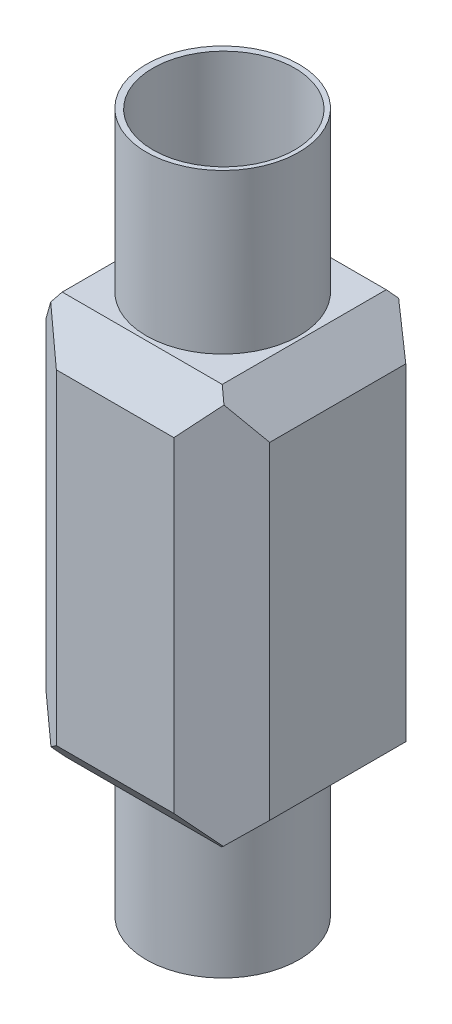
ISO-10303-21;
HEADER;
FILE_DESCRIPTION(('STEP AP214'),'2;1');
FILE_NAME('part.step','',(''),(''),'','','');
FILE_SCHEMA(('AUTOMOTIVE_DESIGN { 1 0 10303 214 1 1 1 1 }'));
ENDSEC;
DATA;
#1=APPLICATION_CONTEXT('core data for automotive mechanical design processes');
#2=APPLICATION_PROTOCOL_DEFINITION('international standard','automotive_design',2000,#1);
#3=PRODUCT_CONTEXT('',#1,'mechanical');
#4=PRODUCT('Part','Part','',(#3));
#5=PRODUCT_RELATED_PRODUCT_CATEGORY('part','',(#4));
#6=PRODUCT_DEFINITION_FORMATION('','',#4);
#7=PRODUCT_DEFINITION_CONTEXT('part definition',#1,'design');
#8=PRODUCT_DEFINITION('design','',#6,#7);
#9=PRODUCT_DEFINITION_SHAPE('','',#8);
#10=(LENGTH_UNIT() NAMED_UNIT(*) SI_UNIT(.MILLI.,.METRE.));
#11=(NAMED_UNIT(*) PLANE_ANGLE_UNIT() SI_UNIT($,.RADIAN.));
#12=(NAMED_UNIT(*) SI_UNIT($,.STERADIAN.) SOLID_ANGLE_UNIT());
#13=UNCERTAINTY_MEASURE_WITH_UNIT(LENGTH_MEASURE(1.E-05),#10,'distance_accuracy_value','');
#14=(GEOMETRIC_REPRESENTATION_CONTEXT(3) GLOBAL_UNCERTAINTY_ASSIGNED_CONTEXT((#13)) GLOBAL_UNIT_ASSIGNED_CONTEXT((#10,
#11,#12)) REPRESENTATION_CONTEXT('',''));
#15=CARTESIAN_POINT('',(0.,0.,0.));
#16=DIRECTION('',(0.,0.,1.));
#17=DIRECTION('',(1.,0.,0.));
#18=AXIS2_PLACEMENT_3D('',#15,#16,#17);
#19=CARTESIAN_POINT('',(0.,180.,0.));
#20=DIRECTION('',(-1.,0.,0.));
#21=DIRECTION('',(0.,0.,1.));
#22=AXIS2_PLACEMENT_3D('',#19,#20,#21);
#23=PLANE('',#22);
#24=DIRECTION('',(0.,0.,1.));
#25=VECTOR('',#24,1.);
#26=CARTESIAN_POINT('',(0.,162.25857257587,0.));
#27=LINE('',#26,#25);
#28=CARTESIAN_POINT('',(0.,162.25857257587,-79.942972796148));
#29=VERTEX_POINT('',#28);
#30=CARTESIAN_POINT('',(0.,162.25857257587,-18.835743686039));
#31=VERTEX_POINT('',#30);
#32=EDGE_CURVE('E266',#29,#31,#27,.T.);
#33=ORIENTED_EDGE('',*,*,#32,.T.);
#34=DIRECTION('',(0.,-1.,0.));
#35=VECTOR('',#34,1.);
#36=CARTESIAN_POINT('',(0.,180.,-18.835743686039));
#37=LINE('',#36,#35);
#38=CARTESIAN_POINT('',(0.,15.2573853040028,-18.835743686039));
#39=VERTEX_POINT('',#38);
#40=EDGE_CURVE('E220',#31,#39,#37,.T.);
#41=ORIENTED_EDGE('',*,*,#40,.T.);
#42=DIRECTION('',(0.,0.,1.));
#43=VECTOR('',#42,1.);
#44=CARTESIAN_POINT('',(0.,15.2573853040028,-400.));
#45=LINE('',#44,#43);
#46=CARTESIAN_POINT('',(0.,15.2573853040028,-79.942972796148));
#47=VERTEX_POINT('',#46);
#48=EDGE_CURVE('E255',#47,#39,#45,.T.);
#49=ORIENTED_EDGE('',*,*,#48,.F.);
#50=DIRECTION('',(0.,1.,0.));
#51=VECTOR('',#50,1.);
#52=CARTESIAN_POINT('',(0.,180.,-79.942972796148));
#53=LINE('',#52,#51);
#54=EDGE_CURVE('E157',#47,#29,#53,.T.);
#55=ORIENTED_EDGE('',*,*,#54,.T.);
#56=EDGE_LOOP('',(#33,#41,#49,#55));
#57=FACE_BOUND('',#56,.T.);
#58=ADVANCED_FACE('F33',(#57),#23,.F.);
#59=CARTESIAN_POINT('',(0.,180.,-100.));
#60=DIRECTION('',(0.,0.,1.));
#61=DIRECTION('',(1.,0.,0.));
#62=AXIS2_PLACEMENT_3D('',#59,#60,#61);
#63=PLANE('',#62);
#64=DIRECTION('',(-1.,0.,0.));
#65=VECTOR('',#64,1.);
#66=CARTESIAN_POINT('',(0.,11.2531638573118,-100.));
#67=LINE('',#66,#65);
#68=CARTESIAN_POINT('',(-26.8680350721203,11.2531638573118,-100.));
#69=VERTEX_POINT('',#68);
#70=CARTESIAN_POINT('',(-78.23623075056,11.2531638573118,-100.));
#71=VERTEX_POINT('',#70);
#72=EDGE_CURVE('E173',#69,#71,#67,.T.);
#73=ORIENTED_EDGE('',*,*,#72,.T.);
#74=DIRECTION('',(0.,1.,0.));
#75=VECTOR('',#74,1.);
#76=CARTESIAN_POINT('',(-78.23623075056,180.,-100.));
#77=LINE('',#76,#75);
#78=CARTESIAN_POINT('',(-78.23623075056,164.310416887307,-100.));
#79=VERTEX_POINT('',#78);
#80=EDGE_CURVE('E246',#71,#79,#77,.T.);
#81=ORIENTED_EDGE('',*,*,#80,.T.);
#82=DIRECTION('',(1.,0.,0.));
#83=VECTOR('',#82,1.);
#84=CARTESIAN_POINT('',(0.,164.310416887307,-100.));
#85=LINE('',#84,#83);
#86=CARTESIAN_POINT('',(-26.8680350721203,164.310416887307,-100.));
#87=VERTEX_POINT('',#86);
#88=EDGE_CURVE('E292',#79,#87,#85,.T.);
#89=ORIENTED_EDGE('',*,*,#88,.T.);
#90=DIRECTION('',(0.,-1.,0.));
#91=VECTOR('',#90,1.);
#92=CARTESIAN_POINT('',(-26.8680350721203,180.,-100.));
#93=LINE('',#92,#91);
#94=EDGE_CURVE('E174',#87,#69,#93,.T.);
#95=ORIENTED_EDGE('',*,*,#94,.T.);
#96=EDGE_LOOP('',(#73,#81,#89,#95));
#97=FACE_BOUND('',#96,.T.);
#98=ADVANCED_FACE('F374',(#97),#63,.F.);
#99=CARTESIAN_POINT('',(-100.,180.,0.));
#100=DIRECTION('',(1.,0.,0.));
#101=DIRECTION('',(0.,0.,-1.));
#102=AXIS2_PLACEMENT_3D('',#99,#100,#101);
#103=PLANE('',#102);
#104=DIRECTION('',(0.,0.,-1.));
#105=VECTOR('',#104,1.);
#106=CARTESIAN_POINT('',(-100.,160.896793159201,0.));
#107=LINE('',#106,#105);
#108=CARTESIAN_POINT('',(-100.,160.896793159201,-18.4618277268646));
#109=VERTEX_POINT('',#108);
#110=CARTESIAN_POINT('',(-100.,160.896793159201,-80.507743362499));
#111=VERTEX_POINT('',#110);
#112=EDGE_CURVE('E277',#109,#111,#107,.T.);
#113=ORIENTED_EDGE('',*,*,#112,.T.);
#114=DIRECTION('',(0.,-1.,0.));
#115=VECTOR('',#114,1.);
#116=CARTESIAN_POINT('',(-100.,180.,-80.507743362499));
#117=LINE('',#116,#115);
#118=CARTESIAN_POINT('',(-100.,14.8474354345408,-80.507743362499));
#119=VERTEX_POINT('',#118);
#120=EDGE_CURVE('E243',#111,#119,#117,.T.);
#121=ORIENTED_EDGE('',*,*,#120,.T.);
#122=DIRECTION('',(0.,0.,1.));
#123=VECTOR('',#122,1.);
#124=CARTESIAN_POINT('',(-100.,14.8474354345408,0.));
#125=LINE('',#124,#123);
#126=CARTESIAN_POINT('',(-100.,14.8474354345408,-18.4618277268646));
#127=VERTEX_POINT('',#126);
#128=EDGE_CURVE('E280',#119,#127,#125,.T.);
#129=ORIENTED_EDGE('',*,*,#128,.T.);
#130=DIRECTION('',(0.,1.,0.));
#131=VECTOR('',#130,1.);
#132=CARTESIAN_POINT('',(-100.,180.,-18.4618277268646));
#133=LINE('',#132,#131);
#134=EDGE_CURVE('E56',#127,#109,#133,.T.);
#135=ORIENTED_EDGE('',*,*,#134,.T.);
#136=EDGE_LOOP('',(#113,#121,#129,#135));
#137=FACE_BOUND('',#136,.T.);
#138=ADVANCED_FACE('F335',(#137),#103,.F.);
#139=CARTESIAN_POINT('',(0.,180.,0.));
#140=DIRECTION('',(0.,0.,-1.));
#141=DIRECTION('',(-1.,0.,0.));
#142=AXIS2_PLACEMENT_3D('',#139,#140,#141);
#143=PLANE('',#142);
#144=DIRECTION('',(1.,0.,0.));
#145=VECTOR('',#144,1.);
#146=CARTESIAN_POINT('',(0.,15.2573853040028,0.));
#147=LINE('',#146,#145);
#148=CARTESIAN_POINT('',(-76.9899954986816,15.2573853040028,0.));
#149=VERTEX_POINT('',#148);
#150=CARTESIAN_POINT('',(-24.2126205432622,15.2573853040028,0.));
#151=VERTEX_POINT('',#150);
#152=EDGE_CURVE('E288',#149,#151,#147,.T.);
#153=ORIENTED_EDGE('',*,*,#152,.T.);
#154=DIRECTION('',(0.,1.,0.));
#155=VECTOR('',#154,1.);
#156=CARTESIAN_POINT('',(-24.2126205432622,180.,0.));
#157=LINE('',#156,#155);
#158=CARTESIAN_POINT('',(-24.2126205432622,161.414269941332,0.));
#159=VERTEX_POINT('',#158);
#160=EDGE_CURVE('E217',#151,#159,#157,.T.);
#161=ORIENTED_EDGE('',*,*,#160,.T.);
#162=DIRECTION('',(-1.,0.,0.));
#163=VECTOR('',#162,1.);
#164=CARTESIAN_POINT('',(0.,161.414269941332,0.));
#165=LINE('',#164,#163);
#166=CARTESIAN_POINT('',(-76.9899954986816,161.414269941332,0.));
#167=VERTEX_POINT('',#166);
#168=EDGE_CURVE('E295',#159,#167,#165,.T.);
#169=ORIENTED_EDGE('',*,*,#168,.T.);
#170=DIRECTION('',(0.,-1.,0.));
#171=VECTOR('',#170,1.);
#172=CARTESIAN_POINT('',(-76.9899954986816,180.,0.));
#173=LINE('',#172,#171);
#174=EDGE_CURVE('E232',#167,#149,#173,.T.);
#175=ORIENTED_EDGE('',*,*,#174,.T.);
#176=EDGE_LOOP('',(#153,#161,#169,#175));
#177=FACE_BOUND('',#176,.T.);
#178=ADVANCED_FACE('F346',(#177),#143,.F.);
#179=CARTESIAN_POINT('',(0.,180.,0.));
#180=DIRECTION('',(0.,1.,0.));
#181=DIRECTION('',(0.,0.,1.));
#182=AXIS2_PLACEMENT_3D('',#179,#180,#181);
#183=PLANE('',#182);
#184=DIRECTION('',(0.,0.,-1.));
#185=VECTOR('',#184,1.);
#186=CARTESIAN_POINT('',(-87.3310077399419,180.,0.));
#187=LINE('',#186,#185);
#188=CARTESIAN_POINT('',(-87.3310077399419,180.,-12.9819708694114));
#189=VERTEX_POINT('',#188);
#190=CARTESIAN_POINT('',(-87.3310077399419,180.,-86.6502872632608));
#191=VERTEX_POINT('',#190);
#192=EDGE_CURVE('E272',#189,#191,#187,.T.);
#193=ORIENTED_EDGE('',*,*,#192,.F.);
#194=DIRECTION('',(-1.,0.,0.));
#195=VECTOR('',#194,1.);
#196=CARTESIAN_POINT('',(0.,180.,-12.9819708694114));
#197=LINE('',#196,#195);
#198=CARTESIAN_POINT('',(-15.4785584814982,180.,-12.9819708694114));
#199=VERTEX_POINT('',#198);
#200=EDGE_CURVE('E312',#199,#189,#197,.T.);
#201=ORIENTED_EDGE('',*,*,#200,.F.);
#202=DIRECTION('',(0.,0.,1.));
#203=VECTOR('',#202,1.);
#204=CARTESIAN_POINT('',(-15.4785584814982,180.,0.));
#205=LINE('',#204,#203);
#206=CARTESIAN_POINT('',(-15.4785584814982,180.,-86.6502872632608));
#207=VERTEX_POINT('',#206);
#208=EDGE_CURVE('E263',#207,#199,#205,.T.);
#209=ORIENTED_EDGE('',*,*,#208,.F.);
#210=DIRECTION('',(1.,0.,0.));
#211=VECTOR('',#210,1.);
#212=CARTESIAN_POINT('',(0.,180.,-86.6502872632607));
#213=LINE('',#212,#211);
#214=EDGE_CURVE('E309',#191,#207,#213,.T.);
#215=ORIENTED_EDGE('',*,*,#214,.F.);
#216=EDGE_LOOP('',(#193,#201,#209,#215));
#217=FACE_BOUND('',#216,.T.);
#218=CARTESIAN_POINT('',(-51.3772918332052,180.,-49.0765363844359));
#219=DIRECTION('',(0.,1.,0.));
#220=DIRECTION('',(0.,0.,1.));
#221=AXIS2_PLACEMENT_3D('',#218,#219,#220);
#222=CIRCLE('',#221,34.2577901971357);
#223=CARTESIAN_POINT('',(-51.3772918332052,180.,-14.8187461873002));
#224=VERTEX_POINT('',#223);
#225=EDGE_CURVE('E298',#224,#224,#222,.F.);
#226=ORIENTED_EDGE('',*,*,#225,.T.);
#227=EDGE_LOOP('',(#226));
#228=FACE_BOUND('',#227,.T.);
#229=ADVANCED_FACE('F328',(#217,#228),#183,.T.);
#230=CARTESIAN_POINT('',(0.,0.,0.));
#231=DIRECTION('',(0.,1.,0.));
#232=DIRECTION('',(0.,0.,1.));
#233=AXIS2_PLACEMENT_3D('',#230,#231,#232);
#234=PLANE('',#233);
#235=DIRECTION('',(1.,0.,0.));
#236=VECTOR('',#235,1.);
#237=CARTESIAN_POINT('',(0.,0.,-86.7744382892866));
#238=LINE('',#237,#236);
#239=CARTESIAN_POINT('',(-85.6232873351068,0.,-86.7744382892867));
#240=VERTEX_POINT('',#239);
#241=CARTESIAN_POINT('',(-15.6949887514202,0.,-86.7744382892866));
#242=VERTEX_POINT('',#241);
#243=EDGE_CURVE('E307',#240,#242,#238,.T.);
#244=ORIENTED_EDGE('',*,*,#243,.T.);
#245=DIRECTION('',(0.,0.,1.));
#246=VECTOR('',#245,1.);
#247=CARTESIAN_POINT('',(-15.6949887514202,0.,-400.));
#248=LINE('',#247,#246);
#249=CARTESIAN_POINT('',(-15.6949887514202,0.,-12.9819708694115));
#250=VERTEX_POINT('',#249);
#251=EDGE_CURVE('E179',#242,#250,#248,.T.);
#252=ORIENTED_EDGE('',*,*,#251,.T.);
#253=DIRECTION('',(-1.,0.,0.));
#254=VECTOR('',#253,1.);
#255=CARTESIAN_POINT('',(0.,0.,-12.9819708694114));
#256=LINE('',#255,#254);
#257=CARTESIAN_POINT('',(-85.6232873351069,0.,-12.9819708694114));
#258=VERTEX_POINT('',#257);
#259=EDGE_CURVE('E304',#250,#258,#256,.T.);
#260=ORIENTED_EDGE('',*,*,#259,.T.);
#261=DIRECTION('',(0.,0.,1.));
#262=VECTOR('',#261,1.);
#263=CARTESIAN_POINT('',(-85.6232873351068,0.,-400.));
#264=LINE('',#263,#262);
#265=CARTESIAN_POINT('',(-85.6232873351068,0.,-48.1776585981388));
#266=VERTEX_POINT('',#265);
#267=EDGE_CURVE('E257',#266,#258,#264,.T.);
#268=ORIENTED_EDGE('',*,*,#267,.F.);
#269=CARTESIAN_POINT('',(-51.3772918332052,0.,-49.0765363844359));
#270=DIRECTION('',(0.,1.,0.));
#271=DIRECTION('',(0.,0.,1.));
#272=AXIS2_PLACEMENT_3D('',#269,#270,#271);
#273=CIRCLE('',#272,34.2577901971357);
#274=CARTESIAN_POINT('',(-85.6232873351068,0.,-49.9754141707329));
#275=VERTEX_POINT('',#274);
#276=EDGE_CURVE('E301',#275,#266,#273,.F.);
#277=ORIENTED_EDGE('',*,*,#276,.F.);
#278=EDGE_CURVE('E262',#240,#275,#264,.T.);
#279=ORIENTED_EDGE('',*,*,#278,.F.);
#280=EDGE_LOOP('',(#244,#252,#260,#268,#277,#279));
#281=FACE_BOUND('',#280,.T.);
#282=ADVANCED_FACE('F355',(#281),#234,.F.);
#283=CARTESIAN_POINT('',(-51.3772918332052,530.,-49.0765363844359));
#284=DIRECTION('',(0.,-1.,0.));
#285=DIRECTION('',(0.,0.,-1.));
#286=AXIS2_PLACEMENT_3D('',#283,#284,#285);
#287=CYLINDRICAL_SURFACE('',#286,34.2577901971357);
#288=CARTESIAN_POINT('',(-51.3772918332052,-62.6813888831705,-49.0765363844359));
#289=DIRECTION('',(0.,1.,0.));
#290=DIRECTION('',(0.,0.,1.));
#291=AXIS2_PLACEMENT_3D('',#288,#289,#290);
#292=CIRCLE('',#291,34.2577901971357);
#293=CARTESIAN_POINT('',(-51.3772918332052,-62.6813888831705,-14.8187461873002));
#294=VERTEX_POINT('',#293);
#295=EDGE_CURVE('E175',#294,#294,#292,.T.);
#296=ORIENTED_EDGE('',*,*,#295,.T.);
#297=EDGE_LOOP('',(#296));
#298=FACE_BOUND('',#297,.T.);
#299=ORIENTED_EDGE('',*,*,#276,.T.);
#300=CARTESIAN_POINT('',(-51.3772918332052,86.1655593743765,-49.0765363844359));
#301=DIRECTION('',(0.929293452580676,-0.369342224760028,0.));
#302=DIRECTION('',(-0.369342224760028,-0.929293452580676,0.));
#303=AXIS2_PLACEMENT_3D('',#300,#301,#302);
#304=ELLIPSE('',#303,92.7535166589576,34.2577901971357);
#305=EDGE_CURVE('E163',#266,#275,#304,.T.);
#306=ORIENTED_EDGE('',*,*,#305,.T.);
#307=EDGE_LOOP('',(#299,#306));
#308=FACE_BOUND('',#307,.T.);
#309=ADVANCED_FACE('F361',(#298,#308),#287,.T.);
#310=CARTESIAN_POINT('',(-51.3772918332052,251.428834106385,-49.0765363844359));
#311=DIRECTION('',(0.,-1.,0.));
#312=DIRECTION('',(0.,0.,-1.));
#313=AXIS2_PLACEMENT_3D('',#310,#311,#312);
#314=CIRCLE('',#313,34.2577901971357);
#315=CARTESIAN_POINT('',(-51.3772918332052,251.428834106385,-83.3343265815716));
#316=VERTEX_POINT('',#315);
#317=EDGE_CURVE('E36',#316,#316,#314,.T.);
#318=ORIENTED_EDGE('',*,*,#317,.T.);
#319=EDGE_LOOP('',(#318));
#320=FACE_BOUND('',#319,.T.);
#321=ORIENTED_EDGE('',*,*,#225,.F.);
#322=EDGE_LOOP('',(#321));
#323=FACE_BOUND('',#322,.T.);
#324=ADVANCED_FACE('F390',(#320,#323),#287,.T.);
#325=CARTESIAN_POINT('',(-400.,0.,-12.9819708694114));
#326=DIRECTION('',(0.,0.648030679802751,-0.761614231769854));
#327=DIRECTION('',(0.,0.761614231769854,0.648030679802751));
#328=AXIS2_PLACEMENT_3D('',#325,#326,#327);
#329=PLANE('',#328);
#330=DIRECTION('',(0.61672298954482,0.599527685323787,0.51011695590051));
#331=VECTOR('',#330,1.);
#332=CARTESIAN_POINT('',(-161.864341339676,-142.093898084117,-133.884655627931));
#333=LINE('',#332,#331);
#334=CARTESIAN_POINT('',(-11.7351397334046,3.84944157466014,-9.70661684314665));
#335=VERTEX_POINT('',#334);
#336=EDGE_CURVE('E285',#250,#335,#333,.T.);
#337=ORIENTED_EDGE('',*,*,#336,.T.);
#338=DIRECTION('',(-0.640041580283072,0.585178886954522,0.49790806959861));
#339=VECTOR('',#338,1.);
#340=CARTESIAN_POINT('',(-168.303530456469,146.997198592356,112.092759301453));
#341=LINE('',#340,#339);
#342=EDGE_CURVE('E214',#335,#151,#341,.T.);
#343=ORIENTED_EDGE('',*,*,#342,.T.);
#344=ORIENTED_EDGE('',*,*,#152,.F.);
#345=DIRECTION('',(-0.628329778342481,-0.592495582556801,-0.504133587751069));
#346=VECTOR('',#345,1.);
#347=CARTESIAN_POINT('',(-214.306055792962,-114.227420195886,-110.174052731693));
#348=LINE('',#347,#346);
#349=CARTESIAN_POINT('',(-89.2252600270588,3.71990859296577,-9.81683188730251));
#350=VERTEX_POINT('',#349);
#351=EDGE_CURVE('E229',#149,#350,#348,.T.);
#352=ORIENTED_EDGE('',*,*,#351,.T.);
#353=DIRECTION('',(0.593525479967305,-0.612958709544806,-0.521544940559053));
#354=VECTOR('',#353,1.);
#355=CARTESIAN_POINT('',(-196.369556391918,114.372326815193,84.3334069228837));
#356=LINE('',#355,#354);
#357=EDGE_CURVE('E283',#350,#258,#356,.T.);
#358=ORIENTED_EDGE('',*,*,#357,.T.);
#359=ORIENTED_EDGE('',*,*,#259,.F.);
#360=EDGE_LOOP('',(#337,#343,#344,#352,#358,#359));
#361=FACE_BOUND('',#360,.T.);
#362=ADVANCED_FACE('F343',(#361),#329,.F.);
#363=CARTESIAN_POINT('',(-400.,-1.44810398413053,-85.072517936176));
#364=DIRECTION('',(0.,0.761614231769854,0.648030679802751));
#365=DIRECTION('',(0.,-0.648030679802751,0.761614231769854));
#366=AXIS2_PLACEMENT_3D('',#363,#364,#365);
#367=PLANE('',#366);
#368=DIRECTION('',(-0.531512068777104,0.548914853332077,-0.645125882704847));
#369=VECTOR('',#368,1.);
#370=CARTESIAN_POINT('',(-173.430238872661,90.6819294539596,-193.350639369007));
#371=LINE('',#370,#369);
#372=CARTESIAN_POINT('',(-88.756666543567,3.23597240717974,-90.5775956331223));
#373=VERTEX_POINT('',#372);
#374=EDGE_CURVE('E181',#240,#373,#371,.T.);
#375=ORIENTED_EDGE('',*,*,#374,.T.);
#376=DIRECTION('',(0.647811274519912,0.49367033016184,-0.580198377904305));
#377=VECTOR('',#376,1.);
#378=CARTESIAN_POINT('',(-222.939997158503,-99.0196253762684,29.6008480382685));
#379=LINE('',#378,#377);
#380=EDGE_CURVE('E49',#373,#71,#379,.T.);
#381=ORIENTED_EDGE('',*,*,#380,.T.);
#382=ORIENTED_EDGE('',*,*,#72,.F.);
#383=DIRECTION('',(0.71415681894842,-0.453612235752694,0.533119102569883));
#384=VECTOR('',#383,1.);
#385=CARTESIAN_POINT('',(-207.374856665364,125.905997435364,-234.7486044833));
#386=LINE('',#385,#384);
#387=CARTESIAN_POINT('',(-13.109045681771,2.51384250175289,-89.7288944368655));
#388=VERTEX_POINT('',#387);
#389=EDGE_CURVE('E154',#69,#388,#386,.T.);
#390=ORIENTED_EDGE('',*,*,#389,.T.);
#391=DIRECTION('',(-0.554671653885714,-0.539206448286052,0.633715837345437));
#392=VECTOR('',#391,1.);
#393=CARTESIAN_POINT('',(-134.961850638957,-115.941495380351,49.48869814313));
#394=LINE('',#393,#392);
#395=EDGE_CURVE('E170',#388,#242,#394,.T.);
#396=ORIENTED_EDGE('',*,*,#395,.T.);
#397=ORIENTED_EDGE('',*,*,#243,.F.);
#398=EDGE_LOOP('',(#375,#381,#382,#390,#396,#397));
#399=FACE_BOUND('',#398,.T.);
#400=ADVANCED_FACE('F168',(#399),#367,.F.);
#401=CARTESIAN_POINT('',(-400.,181.854312783962,-85.072517936176));
#402=DIRECTION('',(0.,-0.648030679802751,0.761614231769854));
#403=DIRECTION('',(0.,-0.761614231769854,-0.648030679802751));
#404=AXIS2_PLACEMENT_3D('',#401,#402,#403);
#405=PLANE('',#404);
#406=ORIENTED_EDGE('',*,*,#88,.F.);
#407=DIRECTION('',(-0.586196421620691,0.617036215494435,0.52501434651579));
#408=VECTOR('',#407,1.);
#409=CARTESIAN_POINT('',(-199.742515919054,292.209147745934,8.82451777669856));
#410=LINE('',#409,#408);
#411=CARTESIAN_POINT('',(-89.7197502262504,176.398084325205,-89.7150302341283));
#412=VERTEX_POINT('',#411);
#413=EDGE_CURVE('E252',#79,#412,#410,.T.);
#414=ORIENTED_EDGE('',*,*,#413,.T.);
#415=DIRECTION('',(0.450846295048029,0.679818082679197,0.578433222337588));
#416=VECTOR('',#415,1.);
#417=CARTESIAN_POINT('',(-149.905059314496,85.6463982645104,-166.932438152694));
#418=LINE('',#417,#416);
#419=EDGE_CURVE('E275',#412,#191,#418,.T.);
#420=ORIENTED_EDGE('',*,*,#419,.T.);
#421=ORIENTED_EDGE('',*,*,#214,.T.);
#422=DIRECTION('',(0.553434352005852,-0.634343010808712,-0.539740088059059));
#423=VECTOR('',#422,1.);
#424=CARTESIAN_POINT('',(-134.375755077368,316.279226961578,29.3048989806743));
#425=LINE('',#424,#423);
#426=CARTESIAN_POINT('',(-12.6631489460901,176.772995107952,-89.3960318760697));
#427=VERTEX_POINT('',#426);
#428=EDGE_CURVE('E269',#207,#427,#425,.T.);
#429=ORIENTED_EDGE('',*,*,#428,.T.);
#430=DIRECTION('',(-0.655544261905661,-0.575138129838513,-0.489364743609938));
#431=VECTOR('',#430,1.);
#432=CARTESIAN_POINT('',(-175.813834897368,33.6336438044814,-211.188255894991));
#433=LINE('',#432,#431);
#434=EDGE_CURVE('E211',#427,#87,#433,.T.);
#435=ORIENTED_EDGE('',*,*,#434,.T.);
#436=EDGE_LOOP('',(#406,#414,#420,#421,#429,#435));
#437=FACE_BOUND('',#436,.T.);
#438=ADVANCED_FACE('F333',(#437),#405,.F.);
#439=CARTESIAN_POINT('',(-400.,180.,-12.9819708694114));
#440=DIRECTION('',(0.,-0.572631952015289,-0.819812568536955));
#441=DIRECTION('',(0.,0.819812568536955,-0.572631952015289));
#442=AXIS2_PLACEMENT_3D('',#439,#440,#441);
#443=PLANE('',#442);
#444=ORIENTED_EDGE('',*,*,#168,.F.);
#445=DIRECTION('',(0.592809662599005,0.660229985740458,-0.461164905276202));
#446=VECTOR('',#445,1.);
#447=CARTESIAN_POINT('',(-145.449727579038,26.3888503175813,94.314081752635));
#448=LINE('',#447,#446);
#449=CARTESIAN_POINT('',(-11.5588061904752,175.50720431267,-9.84379214029944));
#450=VERTEX_POINT('',#449);
#451=EDGE_CURVE('E226',#159,#450,#448,.T.);
#452=ORIENTED_EDGE('',*,*,#451,.T.);
#453=DIRECTION('',(-0.581756229910135,0.666805371044294,-0.465757754747281));
#454=VECTOR('',#453,1.);
#455=CARTESIAN_POINT('',(-145.616114750282,329.16285728132,-117.170929920885));
#456=LINE('',#455,#454);
#457=EDGE_CURVE('E315',#450,#199,#456,.T.);
#458=ORIENTED_EDGE('',*,*,#457,.T.);
#459=ORIENTED_EDGE('',*,*,#200,.T.);
#460=DIRECTION('',(-0.477656087901049,-0.720243793557945,0.503084028301759));
#461=VECTOR('',#460,1.);
#462=CARTESIAN_POINT('',(-158.668107447749,72.4328515506823,62.1527471786135));
#463=LINE('',#462,#461);
#464=CARTESIAN_POINT('',(-89.8558177428235,176.192912054195,-10.3227530364978));
#465=VERTEX_POINT('',#464);
#466=EDGE_CURVE('E185',#189,#465,#463,.T.);
#467=ORIENTED_EDGE('',*,*,#466,.T.);
#468=DIRECTION('',(0.58092414096382,-0.667292755263696,0.466098188387418));
#469=VECTOR('',#468,1.);
#470=CARTESIAN_POINT('',(-196.716895657626,298.941508788201,-96.0615807302122));
#471=LINE('',#470,#469);
#472=EDGE_CURVE('E239',#465,#167,#471,.T.);
#473=ORIENTED_EDGE('',*,*,#472,.T.);
#474=EDGE_LOOP('',(#444,#452,#458,#459,#467,#473));
#475=FACE_BOUND('',#474,.T.);
#476=ADVANCED_FACE('F319',(#475),#443,.F.);
#477=CARTESIAN_POINT('',(-15.6949887514202,180.248071028759,-400.));
#478=DIRECTION('',(-0.753527099389569,-0.657416846822123,0.));
#479=DIRECTION('',(0.657416846822123,-0.753527099389569,0.));
#480=AXIS2_PLACEMENT_3D('',#477,#478,#479);
#481=PLANE('',#480);
#482=ORIENTED_EDGE('',*,*,#457,.F.);
#483=DIRECTION('',(0.585312331350639,-0.670881352389389,-0.45533250025126));
#484=VECTOR('',#483,1.);
#485=CARTESIAN_POINT('',(89.1437612655201,60.0825480645017,-88.1834227365845));
#486=LINE('',#485,#484);
#487=EDGE_CURVE('E223',#450,#31,#486,.T.);
#488=ORIENTED_EDGE('',*,*,#487,.T.);
#489=ORIENTED_EDGE('',*,*,#32,.F.);
#490=DIRECTION('',(-0.590175998555204,0.676456057477596,-0.440567240079464));
#491=VECTOR('',#490,1.);
#492=CARTESIAN_POINT('',(-95.8673346312649,272.14111504508,-151.508077333892));
#493=LINE('',#492,#491);
#494=EDGE_CURVE('E208',#29,#427,#493,.T.);
#495=ORIENTED_EDGE('',*,*,#494,.T.);
#496=ORIENTED_EDGE('',*,*,#428,.F.);
#497=ORIENTED_EDGE('',*,*,#208,.T.);
#498=EDGE_LOOP('',(#482,#488,#489,#495,#496,#497));
#499=FACE_BOUND('',#498,.T.);
#500=ADVANCED_FACE('F350',(#499),#481,.F.);
#501=CARTESIAN_POINT('',(-87.166490338781,180.248071028759,-400.));
#502=DIRECTION('',(0.833386414729428,-0.552690766834791,0.));
#503=DIRECTION('',(0.552690766834791,0.833386414729428,0.));
#504=AXIS2_PLACEMENT_3D('',#501,#502,#503);
#505=PLANE('',#504);
#506=ORIENTED_EDGE('',*,*,#419,.F.);
#507=DIRECTION('',(-0.495327209718188,-0.746889566816963,0.443629271230791));
#508=VECTOR('',#507,1.);
#509=CARTESIAN_POINT('',(-19.4864586420873,282.300832444514,-152.617982767967));
#510=LINE('',#509,#508);
#511=EDGE_CURVE('E249',#412,#111,#510,.T.);
#512=ORIENTED_EDGE('',*,*,#511,.T.);
#513=ORIENTED_EDGE('',*,*,#112,.F.);
#514=DIRECTION('',(0.505242354381561,0.761840326551659,0.40537572717004));
#515=VECTOR('',#514,1.);
#516=CARTESIAN_POINT('',(-167.419386953478,59.237050409762,-72.5550421508174));
#517=LINE('',#516,#515);
#518=EDGE_CURVE('E236',#109,#465,#517,.T.);
#519=ORIENTED_EDGE('',*,*,#518,.T.);
#520=ORIENTED_EDGE('',*,*,#466,.F.);
#521=ORIENTED_EDGE('',*,*,#192,.T.);
#522=EDGE_LOOP('',(#506,#512,#513,#519,#520,#521));
#523=FACE_BOUND('',#522,.T.);
#524=ADVANCED_FACE('F324',(#523),#505,.F.);
#525=CARTESIAN_POINT('',(-93.5263452614059,-19.8847017587749,-400.));
#526=DIRECTION('',(0.929293452580676,-0.369342224760028,0.));
#527=DIRECTION('',(0.369342224760028,0.929293452580676,0.));
#528=AXIS2_PLACEMENT_3D('',#525,#526,#527);
#529=PLANE('',#528);
#530=EDGE_CURVE('E261',#275,#266,#264,.T.);
#531=ORIENTED_EDGE('',*,*,#530,.F.);
#532=ORIENTED_EDGE('',*,*,#305,.F.);
#533=EDGE_LOOP('',(#531,#532));
#534=FACE_BOUND('',#533,.T.);
#535=ADVANCED_FACE('F363',(#534),#529,.F.);
#536=CARTESIAN_POINT('',(-85.6232873351068,0.,-400.));
#537=DIRECTION('',(0.718403190633828,0.695626951524404,0.));
#538=DIRECTION('',(-0.695626951524404,0.718403190633828,0.));
#539=AXIS2_PLACEMENT_3D('',#536,#537,#538);
#540=PLANE('',#539);
#541=ORIENTED_EDGE('',*,*,#128,.F.);
#542=DIRECTION('',(0.590414359571925,-0.609745724749451,-0.528792052853521));
#543=VECTOR('',#542,1.);
#544=CARTESIAN_POINT('',(10.1042154435278,-98.861815628153,-179.120240108721));
#545=LINE('',#544,#543);
#546=EDGE_CURVE('E11',#119,#373,#545,.T.);
#547=ORIENTED_EDGE('',*,*,#546,.T.);
#548=ORIENTED_EDGE('',*,*,#374,.F.);
#549=ORIENTED_EDGE('',*,*,#278,.T.);
#550=ORIENTED_EDGE('',*,*,#530,.T.);
#551=ORIENTED_EDGE('',*,*,#267,.T.);
#552=ORIENTED_EDGE('',*,*,#357,.F.);
#553=DIRECTION('',(-0.60742264461239,0.627310895583479,-0.487358975596371));
#554=VECTOR('',#553,1.);
#555=CARTESIAN_POINT('',(-201.985869600553,120.172529524189,-100.289084867645));
#556=LINE('',#555,#554);
#557=EDGE_CURVE('E41',#350,#127,#556,.T.);
#558=ORIENTED_EDGE('',*,*,#557,.T.);
#559=EDGE_LOOP('',(#541,#547,#548,#549,#550,#551,#552,#558));
#560=FACE_BOUND('',#559,.T.);
#561=ADVANCED_FACE('F338',(#560),#540,.F.);
#562=CARTESIAN_POINT('',(-15.6949887514202,0.,-400.));
#563=DIRECTION('',(-0.697040073938311,0.717032171749687,0.));
#564=DIRECTION('',(-0.717032171749687,-0.697040073938311,0.));
#565=AXIS2_PLACEMENT_3D('',#562,#563,#564);
#566=PLANE('',#565);
#567=ORIENTED_EDGE('',*,*,#48,.T.);
#568=DIRECTION('',(-0.626200927331214,-0.608741361802611,0.487140999137037));
#569=VECTOR('',#568,1.);
#570=CARTESIAN_POINT('',(104.302981271785,116.652218955974,-99.9762471443389));
#571=LINE('',#570,#569);
#572=EDGE_CURVE('E162',#39,#335,#571,.T.);
#573=ORIENTED_EDGE('',*,*,#572,.T.);
#574=ORIENTED_EDGE('',*,*,#336,.F.);
#575=ORIENTED_EDGE('',*,*,#251,.F.);
#576=ORIENTED_EDGE('',*,*,#395,.F.);
#577=DIRECTION('',(0.63216753808039,0.614541613118557,0.471913985322559));
#578=VECTOR('',#577,1.);
#579=CARTESIAN_POINT('',(-107.681868244315,-89.4221261043572,-160.32764383519));
#580=LINE('',#579,#578);
#581=EDGE_CURVE('E151',#388,#47,#580,.T.);
#582=ORIENTED_EDGE('',*,*,#581,.T.);
#583=EDGE_LOOP('',(#567,#573,#574,#575,#576,#582));
#584=FACE_BOUND('',#583,.T.);
#585=ADVANCED_FACE('F177',(#584),#566,.F.);
#586=CARTESIAN_POINT('',(-31.7243853522426,-220.,-103.625272537362));
#587=DIRECTION('',(-0.598204225918444,0.,0.801343686624731));
#588=DIRECTION('',(0.801343686624731,0.,0.598204225918444));
#589=AXIS2_PLACEMENT_3D('',#586,#587,#588);
#590=PLANE('',#589);
#591=ORIENTED_EDGE('',*,*,#494,.F.);
#592=ORIENTED_EDGE('',*,*,#54,.F.);
#593=ORIENTED_EDGE('',*,*,#581,.F.);
#594=ORIENTED_EDGE('',*,*,#389,.F.);
#595=ORIENTED_EDGE('',*,*,#94,.F.);
#596=ORIENTED_EDGE('',*,*,#434,.F.);
#597=EDGE_LOOP('',(#591,#592,#593,#594,#595,#596));
#598=FACE_BOUND('',#597,.T.);
#599=ADVANCED_FACE('F153',(#598),#590,.F.);
#600=CARTESIAN_POINT('',(-38.5315768457559,-220.,11.1391573780071));
#601=DIRECTION('',(-0.614015874090284,0.,-0.789293675614561));
#602=DIRECTION('',(-0.789293675614561,0.,0.614015874090284));
#603=AXIS2_PLACEMENT_3D('',#600,#601,#602);
#604=PLANE('',#603);
#605=ORIENTED_EDGE('',*,*,#160,.F.);
#606=ORIENTED_EDGE('',*,*,#342,.F.);
#607=ORIENTED_EDGE('',*,*,#572,.F.);
#608=ORIENTED_EDGE('',*,*,#40,.F.);
#609=ORIENTED_EDGE('',*,*,#487,.F.);
#610=ORIENTED_EDGE('',*,*,#451,.F.);
#611=EDGE_LOOP('',(#605,#606,#607,#608,#609,#610));
#612=FACE_BOUND('',#611,.T.);
#613=ADVANCED_FACE('F441',(#612),#604,.F.);
#614=CARTESIAN_POINT('',(-112.386997555001,-220.,-28.4004009635807));
#615=DIRECTION('',(0.625806910437033,0.,-0.779978019465456));
#616=DIRECTION('',(-0.779978019465456,0.,-0.625806910437033));
#617=AXIS2_PLACEMENT_3D('',#614,#615,#616);
#618=PLANE('',#617);
#619=ORIENTED_EDGE('',*,*,#518,.F.);
#620=ORIENTED_EDGE('',*,*,#134,.F.);
#621=ORIENTED_EDGE('',*,*,#557,.F.);
#622=ORIENTED_EDGE('',*,*,#351,.F.);
#623=ORIENTED_EDGE('',*,*,#174,.F.);
#624=ORIENTED_EDGE('',*,*,#472,.F.);
#625=EDGE_LOOP('',(#619,#620,#621,#622,#623,#624));
#626=FACE_BOUND('',#625,.T.);
#627=ADVANCED_FACE('F340',(#626),#618,.F.);
#628=CARTESIAN_POINT('',(-66.4286941720711,-220.,-110.575168786561));
#629=DIRECTION('',(0.66716375547024,0.,0.744911084215322));
#630=DIRECTION('',(0.744911084215322,0.,-0.66716375547024));
#631=AXIS2_PLACEMENT_3D('',#628,#629,#630);
#632=PLANE('',#631);
#633=ORIENTED_EDGE('',*,*,#80,.F.);
#634=ORIENTED_EDGE('',*,*,#380,.F.);
#635=ORIENTED_EDGE('',*,*,#546,.F.);
#636=ORIENTED_EDGE('',*,*,#120,.F.);
#637=ORIENTED_EDGE('',*,*,#511,.F.);
#638=ORIENTED_EDGE('',*,*,#413,.F.);
#639=EDGE_LOOP('',(#633,#634,#635,#636,#637,#638));
#640=FACE_BOUND('',#639,.T.);
#641=ADVANCED_FACE('F458',(#640),#632,.F.);
#642=CARTESIAN_POINT('',(-146.202949733734,-62.6813888831705,-400.));
#643=DIRECTION('',(0.,1.,0.));
#644=DIRECTION('',(0.,0.,1.));
#645=AXIS2_PLACEMENT_3D('',#642,#643,#644);
#646=PLANE('',#645);
#647=CARTESIAN_POINT('',(-50.8089931565134,-62.6813888831705,-49.0320363736778));
#648=DIRECTION('',(0.,1.,0.));
#649=DIRECTION('',(0.,0.,1.));
#650=AXIS2_PLACEMENT_3D('',#647,#648,#649);
#651=CIRCLE('',#650,31.8472934226778);
#652=CARTESIAN_POINT('',(-50.8089931565134,-62.6813888831705,-17.184742951));
#653=VERTEX_POINT('',#652);
#654=EDGE_CURVE('E195',#653,#653,#651,.T.);
#655=ORIENTED_EDGE('',*,*,#654,.T.);
#656=EDGE_LOOP('',(#655));
#657=FACE_BOUND('',#656,.T.);
#658=ORIENTED_EDGE('',*,*,#295,.F.);
#659=EDGE_LOOP('',(#658));
#660=FACE_BOUND('',#659,.T.);
#661=ADVANCED_FACE('F467',(#657,#660),#646,.F.);
#662=CARTESIAN_POINT('',(-127.196525587436,251.428834106385,-400.));
#663=DIRECTION('',(0.,-1.,0.));
#664=DIRECTION('',(0.,0.,-1.));
#665=AXIS2_PLACEMENT_3D('',#662,#663,#664);
#666=PLANE('',#665);
#667=CARTESIAN_POINT('',(-50.8089931565134,251.428834106385,-49.0320363736778));
#668=DIRECTION('',(0.,1.,0.));
#669=DIRECTION('',(0.,0.,1.));
#670=AXIS2_PLACEMENT_3D('',#667,#668,#669);
#671=CIRCLE('',#670,31.8472934226778);
#672=CARTESIAN_POINT('',(-50.8089931565134,251.428834106385,-17.184742951));
#673=VERTEX_POINT('',#672);
#674=EDGE_CURVE('E199',#673,#673,#671,.T.);
#675=ORIENTED_EDGE('',*,*,#674,.F.);
#676=EDGE_LOOP('',(#675));
#677=FACE_BOUND('',#676,.T.);
#678=ORIENTED_EDGE('',*,*,#317,.F.);
#679=EDGE_LOOP('',(#678));
#680=FACE_BOUND('',#679,.T.);
#681=ADVANCED_FACE('F491',(#677,#680),#666,.F.);
#682=CARTESIAN_POINT('',(-50.8089931565134,-148.571165893615,-49.0320363736778));
#683=DIRECTION('',(0.,1.,0.));
#684=DIRECTION('',(0.,0.,1.));
#685=AXIS2_PLACEMENT_3D('',#682,#683,#684);
#686=CYLINDRICAL_SURFACE('',#685,31.8472934226778);
#687=ORIENTED_EDGE('',*,*,#674,.T.);
#688=EDGE_LOOP('',(#687));
#689=FACE_BOUND('',#688,.T.);
#690=ORIENTED_EDGE('',*,*,#654,.F.);
#691=EDGE_LOOP('',(#690));
#692=FACE_BOUND('',#691,.T.);
#693=ADVANCED_FACE('F497',(#689,#692),#686,.F.);
#694=CLOSED_SHELL('',(#58,#98,#138,#178,#229,#282,#309,#324,#362,#400,#438,#476,#500,#524,#535,
#561,#585,#599,#613,#627,#641,#661,#681,#693));
#695=MANIFOLD_SOLID_BREP('B2',#694);
#696=ADVANCED_BREP_SHAPE_REPRESENTATION('',(#18,#695),#14);
#697=SHAPE_DEFINITION_REPRESENTATION(#9,#696);
ENDSEC;
END-ISO-10303-21;
